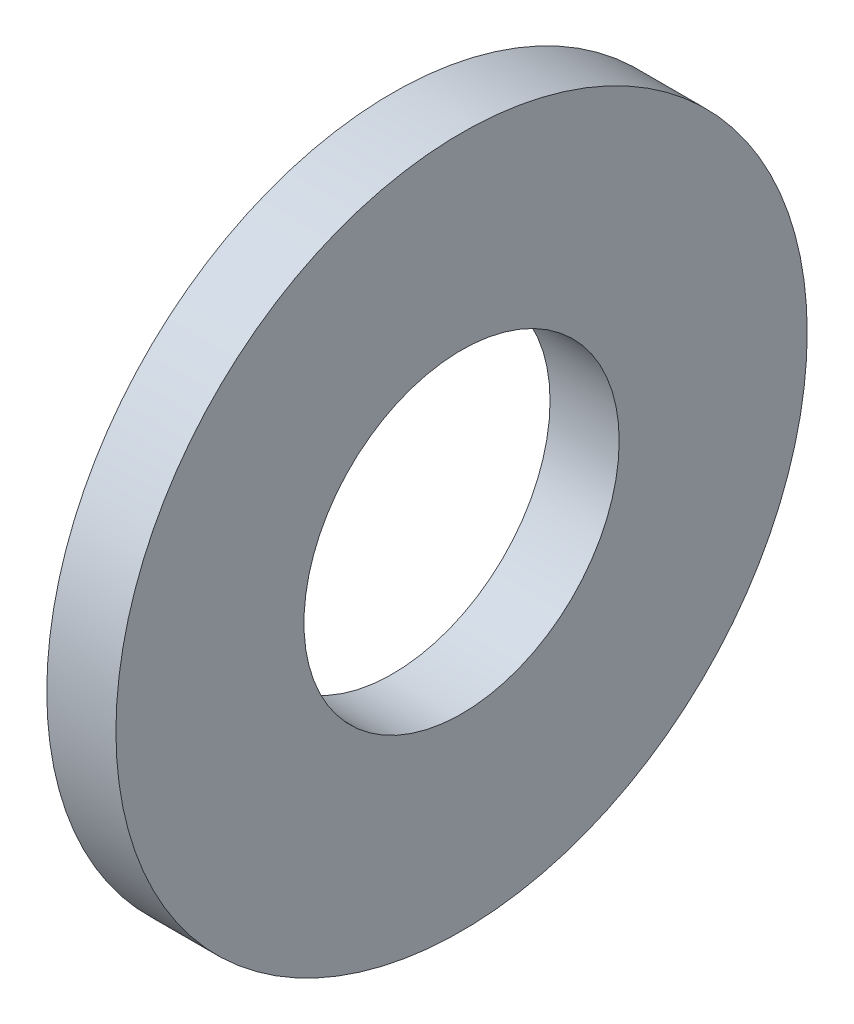
ISO-10303-21;
HEADER;
FILE_DESCRIPTION(('STEP AP214'),'2;1');
FILE_NAME('part.step','',(''),(''),'','','');
FILE_SCHEMA(('AUTOMOTIVE_DESIGN { 1 0 10303 214 1 1 1 1 }'));
ENDSEC;
DATA;
#1=APPLICATION_CONTEXT('core data for automotive mechanical design processes');
#2=APPLICATION_PROTOCOL_DEFINITION('international standard','automotive_design',2000,#1);
#3=PRODUCT_CONTEXT('',#1,'mechanical');
#4=PRODUCT('Part','Part','',(#3));
#5=PRODUCT_RELATED_PRODUCT_CATEGORY('part','',(#4));
#6=PRODUCT_DEFINITION_FORMATION('','',#4);
#7=PRODUCT_DEFINITION_CONTEXT('part definition',#1,'design');
#8=PRODUCT_DEFINITION('design','',#6,#7);
#9=PRODUCT_DEFINITION_SHAPE('','',#8);
#10=(LENGTH_UNIT() NAMED_UNIT(*) SI_UNIT(.MILLI.,.METRE.));
#11=(NAMED_UNIT(*) PLANE_ANGLE_UNIT() SI_UNIT($,.RADIAN.));
#12=(NAMED_UNIT(*) SI_UNIT($,.STERADIAN.) SOLID_ANGLE_UNIT());
#13=UNCERTAINTY_MEASURE_WITH_UNIT(LENGTH_MEASURE(1.E-05),#10,'distance_accuracy_value','');
#14=(GEOMETRIC_REPRESENTATION_CONTEXT(3) GLOBAL_UNCERTAINTY_ASSIGNED_CONTEXT((#13)) GLOBAL_UNIT_ASSIGNED_CONTEXT((#10,
#11,#12)) REPRESENTATION_CONTEXT('',''));
#15=CARTESIAN_POINT('',(0.,0.,0.));
#16=DIRECTION('',(0.,0.,1.));
#17=DIRECTION('',(1.,0.,0.));
#18=AXIS2_PLACEMENT_3D('',#15,#16,#17);
#19=CARTESIAN_POINT('',(1.27,0.,0.));
#20=DIRECTION('',(1.,0.,0.));
#21=DIRECTION('',(0.,0.,-1.));
#22=AXIS2_PLACEMENT_3D('',#19,#20,#21);
#23=PLANE('',#22);
#24=CARTESIAN_POINT('',(1.27,0.,0.));
#25=DIRECTION('',(1.,0.,0.));
#26=DIRECTION('',(0.,0.,-1.));
#27=AXIS2_PLACEMENT_3D('',#24,#25,#26);
#28=CIRCLE('',#27,6.35);
#29=CARTESIAN_POINT('',(1.27,0.,-6.35));
#30=VERTEX_POINT('',#29);
#31=EDGE_CURVE('E10',#30,#30,#28,.T.);
#32=ORIENTED_EDGE('',*,*,#31,.T.);
#33=EDGE_LOOP('',(#32));
#34=FACE_BOUND('',#33,.T.);
#35=CARTESIAN_POINT('',(1.27,0.,0.));
#36=DIRECTION('',(1.,0.,0.));
#37=DIRECTION('',(0.,0.,-1.));
#38=AXIS2_PLACEMENT_3D('',#35,#36,#37);
#39=CIRCLE('',#38,2.8956);
#40=CARTESIAN_POINT('',(1.27,0.,-2.8956));
#41=VERTEX_POINT('',#40);
#42=EDGE_CURVE('E43',#41,#41,#39,.T.);
#43=ORIENTED_EDGE('',*,*,#42,.F.);
#44=EDGE_LOOP('',(#43));
#45=FACE_BOUND('',#44,.T.);
#46=ADVANCED_FACE('F32',(#34,#45),#23,.T.);
#47=CARTESIAN_POINT('',(0.,0.,0.));
#48=DIRECTION('',(1.,0.,0.));
#49=DIRECTION('',(0.,0.,-1.));
#50=AXIS2_PLACEMENT_3D('',#47,#48,#49);
#51=PLANE('',#50);
#52=CARTESIAN_POINT('',(0.,0.,0.));
#53=DIRECTION('',(1.,0.,0.));
#54=DIRECTION('',(0.,0.,-1.));
#55=AXIS2_PLACEMENT_3D('',#52,#53,#54);
#56=CIRCLE('',#55,6.35);
#57=CARTESIAN_POINT('',(0.,0.,-6.35));
#58=VERTEX_POINT('',#57);
#59=EDGE_CURVE('E36',#58,#58,#56,.T.);
#60=ORIENTED_EDGE('',*,*,#59,.F.);
#61=EDGE_LOOP('',(#60));
#62=FACE_BOUND('',#61,.T.);
#63=CARTESIAN_POINT('',(0.,0.,0.));
#64=DIRECTION('',(1.,0.,0.));
#65=DIRECTION('',(0.,0.,-1.));
#66=AXIS2_PLACEMENT_3D('',#63,#64,#65);
#67=CIRCLE('',#66,2.8956);
#68=CARTESIAN_POINT('',(0.,0.,-2.8956));
#69=VERTEX_POINT('',#68);
#70=EDGE_CURVE('E45',#69,#69,#67,.T.);
#71=ORIENTED_EDGE('',*,*,#70,.T.);
#72=EDGE_LOOP('',(#71));
#73=FACE_BOUND('',#72,.T.);
#74=ADVANCED_FACE('F55',(#62,#73),#51,.F.);
#75=CARTESIAN_POINT('',(1.27,0.,0.));
#76=DIRECTION('',(-1.,0.,0.));
#77=DIRECTION('',(0.,0.,1.));
#78=AXIS2_PLACEMENT_3D('',#75,#76,#77);
#79=CYLINDRICAL_SURFACE('',#78,6.35);
#80=ORIENTED_EDGE('',*,*,#31,.F.);
#81=EDGE_LOOP('',(#80));
#82=FACE_BOUND('',#81,.T.);
#83=ORIENTED_EDGE('',*,*,#59,.T.);
#84=EDGE_LOOP('',(#83));
#85=FACE_BOUND('',#84,.T.);
#86=ADVANCED_FACE('F34',(#82,#85),#79,.T.);
#87=CARTESIAN_POINT('',(1.27,0.,0.));
#88=DIRECTION('',(-1.,0.,0.));
#89=DIRECTION('',(0.,0.,1.));
#90=AXIS2_PLACEMENT_3D('',#87,#88,#89);
#91=CYLINDRICAL_SURFACE('',#90,2.8956);
#92=ORIENTED_EDGE('',*,*,#42,.T.);
#93=EDGE_LOOP('',(#92));
#94=FACE_BOUND('',#93,.T.);
#95=ORIENTED_EDGE('',*,*,#70,.F.);
#96=EDGE_LOOP('',(#95));
#97=FACE_BOUND('',#96,.T.);
#98=ADVANCED_FACE('F51',(#94,#97),#91,.F.);
#99=CLOSED_SHELL('',(#46,#74,#86,#98));
#100=MANIFOLD_SOLID_BREP('B2',#99);
#101=ADVANCED_BREP_SHAPE_REPRESENTATION('',(#18,#100),#14);
#102=SHAPE_DEFINITION_REPRESENTATION(#9,#101);
ENDSEC;
END-ISO-10303-21;
